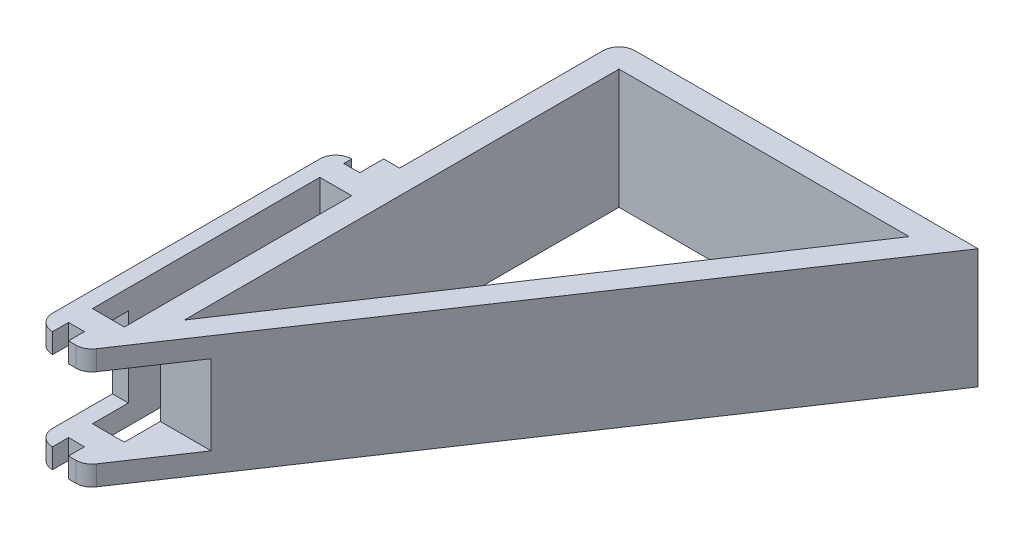
ISO-10303-21;
HEADER;
FILE_DESCRIPTION(('STEP AP214'),'2;1');
FILE_NAME('part.step','',(''),(''),'','','');
FILE_SCHEMA(('AUTOMOTIVE_DESIGN { 1 0 10303 214 1 1 1 1 }'));
ENDSEC;
DATA;
#1=APPLICATION_CONTEXT('core data for automotive mechanical design processes');
#2=APPLICATION_PROTOCOL_DEFINITION('international standard','automotive_design',2000,#1);
#3=PRODUCT_CONTEXT('',#1,'mechanical');
#4=PRODUCT('Part','Part','',(#3));
#5=PRODUCT_RELATED_PRODUCT_CATEGORY('part','',(#4));
#6=PRODUCT_DEFINITION_FORMATION('','',#4);
#7=PRODUCT_DEFINITION_CONTEXT('part definition',#1,'design');
#8=PRODUCT_DEFINITION('design','',#6,#7);
#9=PRODUCT_DEFINITION_SHAPE('','',#8);
#10=(LENGTH_UNIT() NAMED_UNIT(*) SI_UNIT(.MILLI.,.METRE.));
#11=(NAMED_UNIT(*) PLANE_ANGLE_UNIT() SI_UNIT($,.RADIAN.));
#12=(NAMED_UNIT(*) SI_UNIT($,.STERADIAN.) SOLID_ANGLE_UNIT());
#13=UNCERTAINTY_MEASURE_WITH_UNIT(LENGTH_MEASURE(1.E-05),#10,'distance_accuracy_value','');
#14=(GEOMETRIC_REPRESENTATION_CONTEXT(3) GLOBAL_UNCERTAINTY_ASSIGNED_CONTEXT((#13)) GLOBAL_UNIT_ASSIGNED_CONTEXT((#10,
#11,#12)) REPRESENTATION_CONTEXT('',''));
#15=CARTESIAN_POINT('',(0.,0.,0.));
#16=DIRECTION('',(0.,0.,1.));
#17=DIRECTION('',(1.,0.,0.));
#18=AXIS2_PLACEMENT_3D('',#15,#16,#17);
#19=CARTESIAN_POINT('',(0.,15.,-2.));
#20=DIRECTION('',(0.,-1.,0.));
#21=DIRECTION('',(0.,0.,-1.));
#22=AXIS2_PLACEMENT_3D('',#19,#20,#21);
#23=CYLINDRICAL_SURFACE('',#22,2.);
#24=DIRECTION('',(0.,-1.,0.));
#25=VECTOR('',#24,1.);
#26=CARTESIAN_POINT('',(0.,15.,0.));
#27=LINE('',#26,#25);
#28=CARTESIAN_POINT('',(0.,2.5,0.));
#29=VERTEX_POINT('',#28);
#30=CARTESIAN_POINT('',(0.,0.,0.));
#31=VERTEX_POINT('',#30);
#32=EDGE_CURVE('E468',#29,#31,#27,.T.);
#33=ORIENTED_EDGE('',*,*,#32,.F.);
#34=CARTESIAN_POINT('',(0.,2.5,-2.));
#35=DIRECTION('',(0.,1.,0.));
#36=DIRECTION('',(0.,0.,1.));
#37=AXIS2_PLACEMENT_3D('',#34,#35,#36);
#38=CIRCLE('',#37,2.);
#39=CARTESIAN_POINT('',(-2.,2.5,-2.));
#40=VERTEX_POINT('',#39);
#41=EDGE_CURVE('E42',#40,#29,#38,.T.);
#42=ORIENTED_EDGE('',*,*,#41,.F.);
#43=DIRECTION('',(0.,-1.,0.));
#44=VECTOR('',#43,1.);
#45=CARTESIAN_POINT('',(-2.,15.,-2.));
#46=LINE('',#45,#44);
#47=CARTESIAN_POINT('',(-2.,0.,-2.));
#48=VERTEX_POINT('',#47);
#49=EDGE_CURVE('E534',#48,#40,#46,.F.);
#50=ORIENTED_EDGE('',*,*,#49,.F.);
#51=CARTESIAN_POINT('',(0.,0.,-2.));
#52=DIRECTION('',(0.,1.,0.));
#53=DIRECTION('',(0.,0.,1.));
#54=AXIS2_PLACEMENT_3D('',#51,#52,#53);
#55=CIRCLE('',#54,2.);
#56=EDGE_CURVE('E11',#31,#48,#55,.F.);
#57=ORIENTED_EDGE('',*,*,#56,.F.);
#58=EDGE_LOOP('',(#33,#42,#50,#57));
#59=FACE_BOUND('',#58,.T.);
#60=ADVANCED_FACE('F35',(#59),#23,.T.);
#61=CARTESIAN_POINT('',(0.,15.,-2.));
#62=DIRECTION('',(0.,-1.,0.));
#63=DIRECTION('',(0.,0.,-1.));
#64=AXIS2_PLACEMENT_3D('',#61,#62,#63);
#65=CYLINDRICAL_SURFACE('',#64,2.);
#66=CARTESIAN_POINT('',(0.,15.,0.));
#67=VERTEX_POINT('',#66);
#68=CARTESIAN_POINT('',(0.,12.5,0.));
#69=VERTEX_POINT('',#68);
#70=EDGE_CURVE('E469',#67,#69,#27,.T.);
#71=ORIENTED_EDGE('',*,*,#70,.F.);
#72=CARTESIAN_POINT('',(0.,15.,-2.));
#73=DIRECTION('',(0.,1.,0.));
#74=DIRECTION('',(0.,0.,1.));
#75=AXIS2_PLACEMENT_3D('',#72,#73,#74);
#76=CIRCLE('',#75,2.);
#77=CARTESIAN_POINT('',(-2.,15.,-2.));
#78=VERTEX_POINT('',#77);
#79=EDGE_CURVE('E532',#78,#67,#76,.T.);
#80=ORIENTED_EDGE('',*,*,#79,.F.);
#81=DIRECTION('',(0.,-1.,0.));
#82=VECTOR('',#81,1.);
#83=CARTESIAN_POINT('',(-2.,15.,-2.));
#84=LINE('',#83,#82);
#85=CARTESIAN_POINT('',(-2.,12.5,-2.));
#86=VERTEX_POINT('',#85);
#87=EDGE_CURVE('E529',#86,#78,#84,.F.);
#88=ORIENTED_EDGE('',*,*,#87,.F.);
#89=CARTESIAN_POINT('',(0.,12.5,-2.));
#90=DIRECTION('',(0.,-1.,0.));
#91=DIRECTION('',(0.,0.,-1.));
#92=AXIS2_PLACEMENT_3D('',#89,#90,#91);
#93=CIRCLE('',#92,2.);
#94=EDGE_CURVE('E526',#69,#86,#93,.T.);
#95=ORIENTED_EDGE('',*,*,#94,.F.);
#96=EDGE_LOOP('',(#71,#80,#88,#95));
#97=FACE_BOUND('',#96,.T.);
#98=ADVANCED_FACE('F614',(#97),#65,.T.);
#99=CARTESIAN_POINT('',(2.9340491016142,15.,-2.));
#100=DIRECTION('',(0.,-1.,0.));
#101=DIRECTION('',(0.,0.,-1.));
#102=AXIS2_PLACEMENT_3D('',#99,#100,#101);
#103=CYLINDRICAL_SURFACE('',#102,2.);
#104=DIRECTION('',(0.,-1.,0.));
#105=VECTOR('',#104,1.);
#106=CARTESIAN_POINT('',(4.59432751470199,15.,-0.884887633000739));
#107=LINE('',#106,#105);
#108=CARTESIAN_POINT('',(4.59432751470199,15.,-0.88488763300074));
#109=VERTEX_POINT('',#108);
#110=CARTESIAN_POINT('',(4.59432751470199,12.5,-0.884887633000739));
#111=VERTEX_POINT('',#110);
#112=EDGE_CURVE('E517',#109,#111,#107,.T.);
#113=ORIENTED_EDGE('',*,*,#112,.F.);
#114=CARTESIAN_POINT('',(2.9340491016142,15.,-2.));
#115=DIRECTION('',(0.,1.,0.));
#116=DIRECTION('',(0.,0.,1.));
#117=AXIS2_PLACEMENT_3D('',#114,#115,#116);
#118=CIRCLE('',#117,2.);
#119=CARTESIAN_POINT('',(2.9340491016142,15.,0.));
#120=VERTEX_POINT('',#119);
#121=EDGE_CURVE('E522',#120,#109,#118,.T.);
#122=ORIENTED_EDGE('',*,*,#121,.F.);
#123=DIRECTION('',(0.,-1.,0.));
#124=VECTOR('',#123,1.);
#125=CARTESIAN_POINT('',(2.9340491016142,15.,0.));
#126=LINE('',#125,#124);
#127=CARTESIAN_POINT('',(2.9340491016142,12.5,0.));
#128=VERTEX_POINT('',#127);
#129=EDGE_CURVE('E519',#128,#120,#126,.F.);
#130=ORIENTED_EDGE('',*,*,#129,.F.);
#131=CARTESIAN_POINT('',(2.9340491016142,12.5,-2.));
#132=DIRECTION('',(0.,-1.,0.));
#133=DIRECTION('',(0.,0.,-1.));
#134=AXIS2_PLACEMENT_3D('',#131,#132,#133);
#135=CIRCLE('',#134,2.);
#136=EDGE_CURVE('E524',#111,#128,#135,.T.);
#137=ORIENTED_EDGE('',*,*,#136,.F.);
#138=EDGE_LOOP('',(#113,#122,#130,#137));
#139=FACE_BOUND('',#138,.T.);
#140=ADVANCED_FACE('F618',(#139),#103,.T.);
#141=CARTESIAN_POINT('',(2.9340491016142,15.,-2.));
#142=DIRECTION('',(0.,-1.,0.));
#143=DIRECTION('',(0.,0.,-1.));
#144=AXIS2_PLACEMENT_3D('',#141,#142,#143);
#145=CYLINDRICAL_SURFACE('',#144,2.);
#146=DIRECTION('',(0.,-1.,0.));
#147=VECTOR('',#146,1.);
#148=CARTESIAN_POINT('',(4.59432751470199,15.,-0.884887633000739));
#149=LINE('',#148,#147);
#150=CARTESIAN_POINT('',(4.59432751470199,2.5,-0.884887633000739));
#151=VERTEX_POINT('',#150);
#152=CARTESIAN_POINT('',(4.59432751470199,0.,-0.88488763300074));
#153=VERTEX_POINT('',#152);
#154=EDGE_CURVE('E509',#151,#153,#149,.T.);
#155=ORIENTED_EDGE('',*,*,#154,.F.);
#156=CARTESIAN_POINT('',(2.9340491016142,2.5,-2.));
#157=DIRECTION('',(0.,1.,0.));
#158=DIRECTION('',(0.,0.,1.));
#159=AXIS2_PLACEMENT_3D('',#156,#157,#158);
#160=CIRCLE('',#159,2.);
#161=CARTESIAN_POINT('',(2.9340491016142,2.5,0.));
#162=VERTEX_POINT('',#161);
#163=EDGE_CURVE('E273',#162,#151,#160,.T.);
#164=ORIENTED_EDGE('',*,*,#163,.F.);
#165=DIRECTION('',(0.,-1.,0.));
#166=VECTOR('',#165,1.);
#167=CARTESIAN_POINT('',(2.9340491016142,15.,0.));
#168=LINE('',#167,#166);
#169=CARTESIAN_POINT('',(2.9340491016142,0.,0.));
#170=VERTEX_POINT('',#169);
#171=EDGE_CURVE('E511',#170,#162,#168,.F.);
#172=ORIENTED_EDGE('',*,*,#171,.F.);
#173=CARTESIAN_POINT('',(2.9340491016142,0.,-2.));
#174=DIRECTION('',(0.,1.,0.));
#175=DIRECTION('',(0.,0.,1.));
#176=AXIS2_PLACEMENT_3D('',#173,#174,#175);
#177=CIRCLE('',#176,2.);
#178=EDGE_CURVE('E515',#153,#170,#177,.F.);
#179=ORIENTED_EDGE('',*,*,#178,.F.);
#180=EDGE_LOOP('',(#155,#164,#172,#179));
#181=FACE_BOUND('',#180,.T.);
#182=ADVANCED_FACE('F591',(#181),#145,.T.);
#183=CARTESIAN_POINT('',(6.,15.,-65.));
#184=DIRECTION('',(0.,-1.,0.));
#185=DIRECTION('',(0.,0.,-1.));
#186=AXIS2_PLACEMENT_3D('',#183,#184,#185);
#187=CYLINDRICAL_SURFACE('',#186,2.);
#188=DIRECTION('',(0.,-1.,0.));
#189=VECTOR('',#188,1.);
#190=CARTESIAN_POINT('',(4.,15.,-65.));
#191=LINE('',#190,#189);
#192=CARTESIAN_POINT('',(4.,15.,-65.));
#193=VERTEX_POINT('',#192);
#194=CARTESIAN_POINT('',(4.,0.,-65.));
#195=VERTEX_POINT('',#194);
#196=EDGE_CURVE('E499',#193,#195,#191,.T.);
#197=ORIENTED_EDGE('',*,*,#196,.F.);
#198=CARTESIAN_POINT('',(6.,15.,-65.));
#199=DIRECTION('',(0.,1.,0.));
#200=DIRECTION('',(0.,0.,1.));
#201=AXIS2_PLACEMENT_3D('',#198,#199,#200);
#202=CIRCLE('',#201,2.);
#203=CARTESIAN_POINT('',(6.,15.,-67.));
#204=VERTEX_POINT('',#203);
#205=EDGE_CURVE('E505',#204,#193,#202,.T.);
#206=ORIENTED_EDGE('',*,*,#205,.F.);
#207=DIRECTION('',(0.,-1.,0.));
#208=VECTOR('',#207,1.);
#209=CARTESIAN_POINT('',(6.,15.,-67.));
#210=LINE('',#209,#208);
#211=CARTESIAN_POINT('',(6.,0.,-67.));
#212=VERTEX_POINT('',#211);
#213=EDGE_CURVE('E502',#212,#204,#210,.F.);
#214=ORIENTED_EDGE('',*,*,#213,.F.);
#215=CARTESIAN_POINT('',(6.,0.,-65.));
#216=DIRECTION('',(0.,1.,0.));
#217=DIRECTION('',(0.,0.,1.));
#218=AXIS2_PLACEMENT_3D('',#215,#216,#217);
#219=CIRCLE('',#218,2.);
#220=EDGE_CURVE('E507',#195,#212,#219,.F.);
#221=ORIENTED_EDGE('',*,*,#220,.F.);
#222=EDGE_LOOP('',(#197,#206,#214,#221));
#223=FACE_BOUND('',#222,.T.);
#224=ADVANCED_FACE('F582',(#223),#187,.T.);
#225=CARTESIAN_POINT('',(0.,15.,-35.5));
#226=DIRECTION('',(0.,-1.,0.));
#227=DIRECTION('',(0.,0.,-1.));
#228=AXIS2_PLACEMENT_3D('',#225,#226,#227);
#229=CYLINDRICAL_SURFACE('',#228,2.);
#230=DIRECTION('',(0.,-1.,0.));
#231=VECTOR('',#230,1.);
#232=CARTESIAN_POINT('',(-2.,15.,-35.5));
#233=LINE('',#232,#231);
#234=CARTESIAN_POINT('',(-2.,15.,-35.5));
#235=VERTEX_POINT('',#234);
#236=CARTESIAN_POINT('',(-2.,0.,-35.5));
#237=VERTEX_POINT('',#236);
#238=EDGE_CURVE('E492',#235,#237,#233,.T.);
#239=ORIENTED_EDGE('',*,*,#238,.F.);
#240=CARTESIAN_POINT('',(0.,15.,-35.5));
#241=DIRECTION('',(0.,1.,0.));
#242=DIRECTION('',(0.,0.,1.));
#243=AXIS2_PLACEMENT_3D('',#240,#241,#242);
#244=CIRCLE('',#243,2.);
#245=CARTESIAN_POINT('',(0.,15.,-37.5));
#246=VERTEX_POINT('',#245);
#247=EDGE_CURVE('E495',#246,#235,#244,.T.);
#248=ORIENTED_EDGE('',*,*,#247,.F.);
#249=DIRECTION('',(0.,-1.,0.));
#250=VECTOR('',#249,1.);
#251=CARTESIAN_POINT('',(0.,15.,-37.5));
#252=LINE('',#251,#250);
#253=CARTESIAN_POINT('',(0.,0.,-37.5));
#254=VERTEX_POINT('',#253);
#255=EDGE_CURVE('E472',#246,#254,#252,.T.);
#256=ORIENTED_EDGE('',*,*,#255,.T.);
#257=CARTESIAN_POINT('',(0.,0.,-35.5));
#258=DIRECTION('',(0.,1.,0.));
#259=DIRECTION('',(0.,0.,1.));
#260=AXIS2_PLACEMENT_3D('',#257,#258,#259);
#261=CIRCLE('',#260,2.);
#262=EDGE_CURVE('E497',#237,#254,#261,.F.);
#263=ORIENTED_EDGE('',*,*,#262,.F.);
#264=EDGE_LOOP('',(#239,#248,#256,#263));
#265=FACE_BOUND('',#264,.T.);
#266=ADVANCED_FACE('F555',(#265),#229,.T.);
#267=CARTESIAN_POINT('',(0.,15.,0.));
#268=DIRECTION('',(0.,0.,-1.));
#269=DIRECTION('',(-1.,0.,0.));
#270=AXIS2_PLACEMENT_3D('',#267,#268,#269);
#271=PLANE('',#270);
#272=DIRECTION('',(1.,0.,0.));
#273=VECTOR('',#272,1.);
#274=CARTESIAN_POINT('',(0.,0.,0.));
#275=LINE('',#274,#273);
#276=CARTESIAN_POINT('',(2.,0.,0.));
#277=VERTEX_POINT('',#276);
#278=EDGE_CURVE('E409',#277,#170,#275,.T.);
#279=ORIENTED_EDGE('',*,*,#278,.T.);
#280=ORIENTED_EDGE('',*,*,#171,.T.);
#281=DIRECTION('',(1.,0.,0.));
#282=VECTOR('',#281,1.);
#283=CARTESIAN_POINT('',(-120.159716583667,2.5,0.));
#284=LINE('',#283,#282);
#285=CARTESIAN_POINT('',(2.,2.5,0.));
#286=VERTEX_POINT('',#285);
#287=EDGE_CURVE('E297',#286,#162,#284,.T.);
#288=ORIENTED_EDGE('',*,*,#287,.F.);
#289=DIRECTION('',(0.,-1.,0.));
#290=VECTOR('',#289,1.);
#291=CARTESIAN_POINT('',(2.,15.,0.));
#292=LINE('',#291,#290);
#293=EDGE_CURVE('E456',#286,#277,#292,.T.);
#294=ORIENTED_EDGE('',*,*,#293,.T.);
#295=EDGE_LOOP('',(#279,#280,#288,#294));
#296=FACE_BOUND('',#295,.T.);
#297=ADVANCED_FACE('F593',(#296),#271,.F.);
#298=CARTESIAN_POINT('',(0.,15.,-5.));
#299=DIRECTION('',(0.,0.,-1.));
#300=DIRECTION('',(-1.,0.,0.));
#301=AXIS2_PLACEMENT_3D('',#298,#299,#300);
#302=PLANE('',#301);
#303=DIRECTION('',(0.,-1.,0.));
#304=VECTOR('',#303,1.);
#305=CARTESIAN_POINT('',(4.,15.,-5.));
#306=LINE('',#305,#304);
#307=CARTESIAN_POINT('',(4.,15.,-5.));
#308=VERTEX_POINT('',#307);
#309=CARTESIAN_POINT('',(4.,12.5,-5.));
#310=VERTEX_POINT('',#309);
#311=EDGE_CURVE('E442',#308,#310,#306,.T.);
#312=ORIENTED_EDGE('',*,*,#311,.T.);
#313=DIRECTION('',(-1.,0.,0.));
#314=VECTOR('',#313,1.);
#315=CARTESIAN_POINT('',(0.,12.5,-5.));
#316=LINE('',#315,#314);
#317=CARTESIAN_POINT('',(0.,12.5,-5.));
#318=VERTEX_POINT('',#317);
#319=EDGE_CURVE('E323',#310,#318,#316,.T.);
#320=ORIENTED_EDGE('',*,*,#319,.T.);
#321=DIRECTION('',(0.,-1.,0.));
#322=VECTOR('',#321,1.);
#323=CARTESIAN_POINT('',(0.,15.,-5.));
#324=LINE('',#323,#322);
#325=CARTESIAN_POINT('',(0.,15.,-5.));
#326=VERTEX_POINT('',#325);
#327=EDGE_CURVE('E437',#326,#318,#324,.T.);
#328=ORIENTED_EDGE('',*,*,#327,.F.);
#329=DIRECTION('',(1.,0.,0.));
#330=VECTOR('',#329,1.);
#331=CARTESIAN_POINT('',(0.,15.,-5.));
#332=LINE('',#331,#330);
#333=EDGE_CURVE('E368',#326,#308,#332,.T.);
#334=ORIENTED_EDGE('',*,*,#333,.T.);
#335=EDGE_LOOP('',(#312,#320,#328,#334));
#336=FACE_BOUND('',#335,.T.);
#337=ADVANCED_FACE('F696',(#336),#302,.T.);
#338=CARTESIAN_POINT('',(0.,2.5,-5.));
#339=VERTEX_POINT('',#338);
#340=CARTESIAN_POINT('',(0.,0.,-5.));
#341=VERTEX_POINT('',#340);
#342=EDGE_CURVE('E451',#339,#341,#324,.T.);
#343=ORIENTED_EDGE('',*,*,#342,.F.);
#344=DIRECTION('',(1.,0.,0.));
#345=VECTOR('',#344,1.);
#346=CARTESIAN_POINT('',(0.,2.5,-5.));
#347=LINE('',#346,#345);
#348=CARTESIAN_POINT('',(4.00000000000001,2.5,-5.));
#349=VERTEX_POINT('',#348);
#350=EDGE_CURVE('E311',#339,#349,#347,.T.);
#351=ORIENTED_EDGE('',*,*,#350,.T.);
#352=CARTESIAN_POINT('',(4.,0.,-5.));
#353=VERTEX_POINT('',#352);
#354=EDGE_CURVE('E446',#349,#353,#306,.T.);
#355=ORIENTED_EDGE('',*,*,#354,.T.);
#356=DIRECTION('',(1.,0.,0.));
#357=VECTOR('',#356,1.);
#358=CARTESIAN_POINT('',(0.,0.,-5.));
#359=LINE('',#358,#357);
#360=EDGE_CURVE('E417',#341,#353,#359,.T.);
#361=ORIENTED_EDGE('',*,*,#360,.F.);
#362=EDGE_LOOP('',(#343,#351,#355,#361));
#363=FACE_BOUND('',#362,.T.);
#364=ADVANCED_FACE('F651',(#363),#302,.T.);
#365=CARTESIAN_POINT('',(0.,15.,0.));
#366=DIRECTION('',(1.,0.,0.));
#367=DIRECTION('',(0.,0.,-1.));
#368=AXIS2_PLACEMENT_3D('',#365,#366,#367);
#369=PLANE('',#368);
#370=ORIENTED_EDGE('',*,*,#327,.T.);
#371=DIRECTION('',(0.,0.,-1.));
#372=VECTOR('',#371,1.);
#373=CARTESIAN_POINT('',(0.,12.5,0.));
#374=LINE('',#373,#372);
#375=CARTESIAN_POINT('',(0.,12.5,-9.5));
#376=VERTEX_POINT('',#375);
#377=EDGE_CURVE('E325',#318,#376,#374,.T.);
#378=ORIENTED_EDGE('',*,*,#377,.T.);
#379=DIRECTION('',(0.,-1.,0.));
#380=VECTOR('',#379,1.);
#381=CARTESIAN_POINT('',(0.,15.,-9.5));
#382=LINE('',#381,#380);
#383=CARTESIAN_POINT('',(0.,2.5,-9.5));
#384=VERTEX_POINT('',#383);
#385=EDGE_CURVE('E290',#376,#384,#382,.T.);
#386=ORIENTED_EDGE('',*,*,#385,.T.);
#387=DIRECTION('',(0.,0.,1.));
#388=VECTOR('',#387,1.);
#389=CARTESIAN_POINT('',(0.,2.5,0.));
#390=LINE('',#389,#388);
#391=EDGE_CURVE('E278',#384,#339,#390,.T.);
#392=ORIENTED_EDGE('',*,*,#391,.T.);
#393=ORIENTED_EDGE('',*,*,#342,.T.);
#394=DIRECTION('',(0.,0.,1.));
#395=VECTOR('',#394,1.);
#396=CARTESIAN_POINT('',(0.,0.,0.));
#397=LINE('',#396,#395);
#398=CARTESIAN_POINT('',(0.,0.,-33.5));
#399=VERTEX_POINT('',#398);
#400=EDGE_CURVE('E420',#399,#341,#397,.T.);
#401=ORIENTED_EDGE('',*,*,#400,.F.);
#402=DIRECTION('',(0.,-1.,0.));
#403=VECTOR('',#402,1.);
#404=CARTESIAN_POINT('',(0.,15.,-33.5));
#405=LINE('',#404,#403);
#406=CARTESIAN_POINT('',(0.,15.,-33.5));
#407=VERTEX_POINT('',#406);
#408=EDGE_CURVE('E449',#407,#399,#405,.T.);
#409=ORIENTED_EDGE('',*,*,#408,.F.);
#410=DIRECTION('',(0.,0.,1.));
#411=VECTOR('',#410,1.);
#412=CARTESIAN_POINT('',(0.,15.,0.));
#413=LINE('',#412,#411);
#414=EDGE_CURVE('E371',#407,#326,#413,.T.);
#415=ORIENTED_EDGE('',*,*,#414,.T.);
#416=EDGE_LOOP('',(#370,#378,#386,#392,#393,#401,#409,#415));
#417=FACE_BOUND('',#416,.T.);
#418=ADVANCED_FACE('F645',(#417),#369,.T.);
#419=CARTESIAN_POINT('',(0.,15.,0.));
#420=DIRECTION('',(-1.,0.,0.));
#421=DIRECTION('',(0.,0.,1.));
#422=AXIS2_PLACEMENT_3D('',#419,#420,#421);
#423=PLANE('',#422);
#424=DIRECTION('',(0.,0.,1.));
#425=VECTOR('',#424,1.);
#426=CARTESIAN_POINT('',(0.,12.5,0.));
#427=LINE('',#426,#425);
#428=CARTESIAN_POINT('',(0.,12.5,-2.));
#429=VERTEX_POINT('',#428);
#430=EDGE_CURVE('E334',#429,#69,#427,.T.);
#431=ORIENTED_EDGE('',*,*,#430,.F.);
#432=DIRECTION('',(0.,-1.,0.));
#433=VECTOR('',#432,1.);
#434=CARTESIAN_POINT('',(0.,15.,-2.));
#435=LINE('',#434,#433);
#436=CARTESIAN_POINT('',(0.,15.,-2.));
#437=VERTEX_POINT('',#436);
#438=EDGE_CURVE('E465',#437,#429,#435,.T.);
#439=ORIENTED_EDGE('',*,*,#438,.F.);
#440=DIRECTION('',(0.,0.,-1.));
#441=VECTOR('',#440,1.);
#442=CARTESIAN_POINT('',(0.,15.,0.));
#443=LINE('',#442,#441);
#444=EDGE_CURVE('E354',#67,#437,#443,.T.);
#445=ORIENTED_EDGE('',*,*,#444,.F.);
#446=ORIENTED_EDGE('',*,*,#70,.T.);
#447=EDGE_LOOP('',(#431,#439,#445,#446));
#448=FACE_BOUND('',#447,.T.);
#449=ADVANCED_FACE('F643',(#448),#423,.F.);
#450=DIRECTION('',(0.,0.,-1.));
#451=VECTOR('',#450,1.);
#452=CARTESIAN_POINT('',(0.,2.5,0.));
#453=LINE('',#452,#451);
#454=CARTESIAN_POINT('',(0.,2.5,-2.));
#455=VERTEX_POINT('',#454);
#456=EDGE_CURVE('E291',#29,#455,#453,.T.);
#457=ORIENTED_EDGE('',*,*,#456,.F.);
#458=ORIENTED_EDGE('',*,*,#32,.T.);
#459=DIRECTION('',(0.,0.,-1.));
#460=VECTOR('',#459,1.);
#461=CARTESIAN_POINT('',(0.,0.,0.));
#462=LINE('',#461,#460);
#463=CARTESIAN_POINT('',(0.,0.,-2.));
#464=VERTEX_POINT('',#463);
#465=EDGE_CURVE('E400',#31,#464,#462,.T.);
#466=ORIENTED_EDGE('',*,*,#465,.T.);
#467=EDGE_CURVE('E464',#455,#464,#435,.T.);
#468=ORIENTED_EDGE('',*,*,#467,.F.);
#469=EDGE_LOOP('',(#457,#458,#466,#468));
#470=FACE_BOUND('',#469,.T.);
#471=ADVANCED_FACE('F540',(#470),#423,.F.);
#472=CARTESIAN_POINT('',(0.,15.,-2.));
#473=DIRECTION('',(0.,0.,-1.));
#474=DIRECTION('',(-1.,0.,0.));
#475=AXIS2_PLACEMENT_3D('',#472,#473,#474);
#476=PLANE('',#475);
#477=DIRECTION('',(-1.,0.,0.));
#478=VECTOR('',#477,1.);
#479=CARTESIAN_POINT('',(0.,12.5,-2.));
#480=LINE('',#479,#478);
#481=CARTESIAN_POINT('',(2.,12.5,-2.));
#482=VERTEX_POINT('',#481);
#483=EDGE_CURVE('E331',#482,#429,#480,.T.);
#484=ORIENTED_EDGE('',*,*,#483,.F.);
#485=DIRECTION('',(0.,-1.,0.));
#486=VECTOR('',#485,1.);
#487=CARTESIAN_POINT('',(2.,15.,-2.));
#488=LINE('',#487,#486);
#489=CARTESIAN_POINT('',(2.,15.,-2.));
#490=VERTEX_POINT('',#489);
#491=EDGE_CURVE('E461',#490,#482,#488,.T.);
#492=ORIENTED_EDGE('',*,*,#491,.F.);
#493=DIRECTION('',(1.,0.,0.));
#494=VECTOR('',#493,1.);
#495=CARTESIAN_POINT('',(0.,15.,-2.));
#496=LINE('',#495,#494);
#497=EDGE_CURVE('E356',#437,#490,#496,.T.);
#498=ORIENTED_EDGE('',*,*,#497,.F.);
#499=ORIENTED_EDGE('',*,*,#438,.T.);
#500=EDGE_LOOP('',(#484,#492,#498,#499));
#501=FACE_BOUND('',#500,.T.);
#502=ADVANCED_FACE('F603',(#501),#476,.F.);
#503=DIRECTION('',(1.,0.,0.));
#504=VECTOR('',#503,1.);
#505=CARTESIAN_POINT('',(0.,2.5,-2.));
#506=LINE('',#505,#504);
#507=CARTESIAN_POINT('',(2.,2.5,-2.));
#508=VERTEX_POINT('',#507);
#509=EDGE_CURVE('E317',#455,#508,#506,.T.);
#510=ORIENTED_EDGE('',*,*,#509,.F.);
#511=ORIENTED_EDGE('',*,*,#467,.T.);
#512=DIRECTION('',(1.,0.,0.));
#513=VECTOR('',#512,1.);
#514=CARTESIAN_POINT('',(0.,0.,-2.));
#515=LINE('',#514,#513);
#516=CARTESIAN_POINT('',(2.,0.,-2.));
#517=VERTEX_POINT('',#516);
#518=EDGE_CURVE('E403',#464,#517,#515,.T.);
#519=ORIENTED_EDGE('',*,*,#518,.T.);
#520=EDGE_CURVE('E460',#508,#517,#488,.T.);
#521=ORIENTED_EDGE('',*,*,#520,.F.);
#522=EDGE_LOOP('',(#510,#511,#519,#521));
#523=FACE_BOUND('',#522,.T.);
#524=ADVANCED_FACE('F600',(#523),#476,.F.);
#525=CARTESIAN_POINT('',(2.,15.,0.));
#526=DIRECTION('',(1.,0.,0.));
#527=DIRECTION('',(0.,0.,-1.));
#528=AXIS2_PLACEMENT_3D('',#525,#526,#527);
#529=PLANE('',#528);
#530=DIRECTION('',(0.,0.,-1.));
#531=VECTOR('',#530,1.);
#532=CARTESIAN_POINT('',(2.,12.5,0.));
#533=LINE('',#532,#531);
#534=CARTESIAN_POINT('',(2.,12.5,0.));
#535=VERTEX_POINT('',#534);
#536=EDGE_CURVE('E328',#535,#482,#533,.T.);
#537=ORIENTED_EDGE('',*,*,#536,.F.);
#538=CARTESIAN_POINT('',(2.,15.,0.));
#539=VERTEX_POINT('',#538);
#540=EDGE_CURVE('E457',#539,#535,#292,.T.);
#541=ORIENTED_EDGE('',*,*,#540,.F.);
#542=DIRECTION('',(0.,0.,1.));
#543=VECTOR('',#542,1.);
#544=CARTESIAN_POINT('',(2.,15.,0.));
#545=LINE('',#544,#543);
#546=EDGE_CURVE('E358',#490,#539,#545,.T.);
#547=ORIENTED_EDGE('',*,*,#546,.F.);
#548=ORIENTED_EDGE('',*,*,#491,.T.);
#549=EDGE_LOOP('',(#537,#541,#547,#548));
#550=FACE_BOUND('',#549,.T.);
#551=ADVANCED_FACE('F602',(#550),#529,.F.);
#552=DIRECTION('',(0.,0.,1.));
#553=VECTOR('',#552,1.);
#554=CARTESIAN_POINT('',(2.,2.5,0.));
#555=LINE('',#554,#553);
#556=EDGE_CURVE('E277',#508,#286,#555,.T.);
#557=ORIENTED_EDGE('',*,*,#556,.F.);
#558=ORIENTED_EDGE('',*,*,#520,.T.);
#559=DIRECTION('',(0.,0.,1.));
#560=VECTOR('',#559,1.);
#561=CARTESIAN_POINT('',(2.,0.,0.));
#562=LINE('',#561,#560);
#563=EDGE_CURVE('E406',#517,#277,#562,.T.);
#564=ORIENTED_EDGE('',*,*,#563,.T.);
#565=ORIENTED_EDGE('',*,*,#293,.F.);
#566=EDGE_LOOP('',(#557,#558,#564,#565));
#567=FACE_BOUND('',#566,.T.);
#568=ADVANCED_FACE('F596',(#567),#529,.F.);
#569=CARTESIAN_POINT('',(2.75652440896531,15.,1.8513969910961));
#570=DIRECTION('',(-0.830139206543894,0.,-0.55755618349963));
#571=DIRECTION('',(-0.55755618349963,0.,0.830139206543894));
#572=AXIS2_PLACEMENT_3D('',#569,#570,#571);
#573=PLANE('',#572);
#574=DIRECTION('',(0.55755618349963,0.,-0.830139206543895));
#575=VECTOR('',#574,1.);
#576=CARTESIAN_POINT('',(2.75652440896531,15.,1.8513969910961));
#577=LINE('',#576,#575);
#578=CARTESIAN_POINT('',(49.,15.,-67.));
#579=VERTEX_POINT('',#578);
#580=EDGE_CURVE('E363',#109,#579,#577,.T.);
#581=ORIENTED_EDGE('',*,*,#580,.F.);
#582=ORIENTED_EDGE('',*,*,#112,.T.);
#583=DIRECTION('',(-0.55755618349963,0.,0.830139206543894));
#584=VECTOR('',#583,1.);
#585=CARTESIAN_POINT('',(2.75652440896531,12.5,1.8513969910961));
#586=LINE('',#585,#584);
#587=CARTESIAN_POINT('',(10.3805970149254,12.5,-9.50000000000001));
#588=VERTEX_POINT('',#587);
#589=EDGE_CURVE('E286',#588,#111,#586,.T.);
#590=ORIENTED_EDGE('',*,*,#589,.F.);
#591=DIRECTION('',(0.,1.,0.));
#592=VECTOR('',#591,1.);
#593=CARTESIAN_POINT('',(10.3805970149254,15.,-9.50000000000001));
#594=LINE('',#593,#592);
#595=CARTESIAN_POINT('',(10.3805970149254,2.5,-9.50000000000001));
#596=VERTEX_POINT('',#595);
#597=EDGE_CURVE('E281',#596,#588,#594,.T.);
#598=ORIENTED_EDGE('',*,*,#597,.F.);
#599=DIRECTION('',(0.55755618349963,0.,-0.830139206543894));
#600=VECTOR('',#599,1.);
#601=CARTESIAN_POINT('',(2.7565244089653,2.5,1.8513969910961));
#602=LINE('',#601,#600);
#603=EDGE_CURVE('E265',#151,#596,#602,.T.);
#604=ORIENTED_EDGE('',*,*,#603,.F.);
#605=ORIENTED_EDGE('',*,*,#154,.T.);
#606=DIRECTION('',(0.55755618349963,0.,-0.830139206543895));
#607=VECTOR('',#606,1.);
#608=CARTESIAN_POINT('',(2.75652440896531,0.,1.8513969910961));
#609=LINE('',#608,#607);
#610=CARTESIAN_POINT('',(49.,0.,-67.));
#611=VERTEX_POINT('',#610);
#612=EDGE_CURVE('E412',#153,#611,#609,.T.);
#613=ORIENTED_EDGE('',*,*,#612,.T.);
#614=DIRECTION('',(0.,-1.,0.));
#615=VECTOR('',#614,1.);
#616=CARTESIAN_POINT('',(49.,15.,-67.));
#617=LINE('',#616,#615);
#618=EDGE_CURVE('E385',#579,#611,#617,.T.);
#619=ORIENTED_EDGE('',*,*,#618,.F.);
#620=EDGE_LOOP('',(#581,#582,#590,#598,#604,#605,#613,#619));
#621=FACE_BOUND('',#620,.T.);
#622=ADVANCED_FACE('F283',(#621),#573,.F.);
#623=CARTESIAN_POINT('',(4.00000000000001,15.,0.));
#624=DIRECTION('',(1.,0.,0.));
#625=DIRECTION('',(0.,0.,-1.));
#626=AXIS2_PLACEMENT_3D('',#623,#624,#625);
#627=PLANE('',#626);
#628=DIRECTION('',(0.,0.,-1.));
#629=VECTOR('',#628,1.);
#630=CARTESIAN_POINT('',(4.00000000000001,12.5,0.));
#631=LINE('',#630,#629);
#632=CARTESIAN_POINT('',(4.00000000000001,12.5,-9.5));
#633=VERTEX_POINT('',#632);
#634=EDGE_CURVE('E489',#310,#633,#631,.T.);
#635=ORIENTED_EDGE('',*,*,#634,.F.);
#636=ORIENTED_EDGE('',*,*,#311,.F.);
#637=DIRECTION('',(0.,0.,1.));
#638=VECTOR('',#637,1.);
#639=CARTESIAN_POINT('',(4.00000000000001,15.,0.));
#640=LINE('',#639,#638);
#641=CARTESIAN_POINT('',(4.,15.,-33.5));
#642=VERTEX_POINT('',#641);
#643=EDGE_CURVE('E342',#642,#308,#640,.T.);
#644=ORIENTED_EDGE('',*,*,#643,.F.);
#645=DIRECTION('',(0.,-1.,0.));
#646=VECTOR('',#645,1.);
#647=CARTESIAN_POINT('',(4.,15.,-33.5));
#648=LINE('',#647,#646);
#649=CARTESIAN_POINT('',(4.,0.,-33.5));
#650=VERTEX_POINT('',#649);
#651=EDGE_CURVE('E445',#642,#650,#648,.T.);
#652=ORIENTED_EDGE('',*,*,#651,.T.);
#653=DIRECTION('',(0.,0.,1.));
#654=VECTOR('',#653,1.);
#655=CARTESIAN_POINT('',(4.00000000000001,0.,0.));
#656=LINE('',#655,#654);
#657=EDGE_CURVE('E388',#650,#353,#656,.T.);
#658=ORIENTED_EDGE('',*,*,#657,.T.);
#659=ORIENTED_EDGE('',*,*,#354,.F.);
#660=DIRECTION('',(0.,0.,1.));
#661=VECTOR('',#660,1.);
#662=CARTESIAN_POINT('',(4.00000000000001,2.5,0.));
#663=LINE('',#662,#661);
#664=CARTESIAN_POINT('',(4.00000000000001,2.5,-9.5));
#665=VERTEX_POINT('',#664);
#666=EDGE_CURVE('E441',#665,#349,#663,.T.);
#667=ORIENTED_EDGE('',*,*,#666,.F.);
#668=DIRECTION('',(0.,-1.,0.));
#669=VECTOR('',#668,1.);
#670=CARTESIAN_POINT('',(4.00000000000001,15.,-9.5));
#671=LINE('',#670,#669);
#672=EDGE_CURVE('E295',#633,#665,#671,.T.);
#673=ORIENTED_EDGE('',*,*,#672,.F.);
#674=EDGE_LOOP('',(#635,#636,#644,#652,#658,#659,#667,#673));
#675=FACE_BOUND('',#674,.T.);
#676=ADVANCED_FACE('F700',(#675),#627,.F.);
#677=CARTESIAN_POINT('',(7.00000000000001,15.,0.));
#678=DIRECTION('',(1.,0.,0.));
#679=DIRECTION('',(0.,0.,-1.));
#680=AXIS2_PLACEMENT_3D('',#677,#678,#679);
#681=PLANE('',#680);
#682=DIRECTION('',(0.,0.,1.));
#683=VECTOR('',#682,1.);
#684=CARTESIAN_POINT('',(7.00000000000001,0.,0.));
#685=LINE('',#684,#683);
#686=CARTESIAN_POINT('',(7.,0.,-64.));
#687=VERTEX_POINT('',#686);
#688=CARTESIAN_POINT('',(7.00000000000001,0.,-9.51623848099053));
#689=VERTEX_POINT('',#688);
#690=EDGE_CURVE('E426',#687,#689,#685,.T.);
#691=ORIENTED_EDGE('',*,*,#690,.F.);
#692=DIRECTION('',(0.,-1.,0.));
#693=VECTOR('',#692,1.);
#694=CARTESIAN_POINT('',(7.,15.,-64.));
#695=LINE('',#694,#693);
#696=CARTESIAN_POINT('',(7.,15.,-64.));
#697=VERTEX_POINT('',#696);
#698=EDGE_CURVE('E439',#697,#687,#695,.T.);
#699=ORIENTED_EDGE('',*,*,#698,.F.);
#700=DIRECTION('',(0.,0.,1.));
#701=VECTOR('',#700,1.);
#702=CARTESIAN_POINT('',(7.00000000000001,15.,0.));
#703=LINE('',#702,#701);
#704=CARTESIAN_POINT('',(7.00000000000001,15.,-9.51623848099053));
#705=VERTEX_POINT('',#704);
#706=EDGE_CURVE('E377',#697,#705,#703,.T.);
#707=ORIENTED_EDGE('',*,*,#706,.T.);
#708=DIRECTION('',(0.,-1.,0.));
#709=VECTOR('',#708,1.);
#710=CARTESIAN_POINT('',(7.00000000000001,15.,-9.51623848099053));
#711=LINE('',#710,#709);
#712=EDGE_CURVE('E434',#705,#689,#711,.T.);
#713=ORIENTED_EDGE('',*,*,#712,.T.);
#714=EDGE_LOOP('',(#691,#699,#707,#713));
#715=FACE_BOUND('',#714,.T.);
#716=ADVANCED_FACE('F702',(#715),#681,.T.);
#717=CARTESIAN_POINT('',(0.,15.,-64.));
#718=DIRECTION('',(0.,0.,-1.));
#719=DIRECTION('',(-1.,0.,0.));
#720=AXIS2_PLACEMENT_3D('',#717,#718,#719);
#721=PLANE('',#720);
#722=DIRECTION('',(1.,0.,0.));
#723=VECTOR('',#722,1.);
#724=CARTESIAN_POINT('',(0.,0.,-64.));
#725=LINE('',#724,#723);
#726=CARTESIAN_POINT('',(43.3712229061526,0.,-64.));
#727=VERTEX_POINT('',#726);
#728=EDGE_CURVE('E429',#687,#727,#725,.T.);
#729=ORIENTED_EDGE('',*,*,#728,.T.);
#730=DIRECTION('',(0.,-1.,0.));
#731=VECTOR('',#730,1.);
#732=CARTESIAN_POINT('',(43.3712229061526,15.,-64.));
#733=LINE('',#732,#731);
#734=CARTESIAN_POINT('',(43.3712229061526,15.,-64.));
#735=VERTEX_POINT('',#734);
#736=EDGE_CURVE('E436',#735,#727,#733,.T.);
#737=ORIENTED_EDGE('',*,*,#736,.F.);
#738=DIRECTION('',(1.,0.,0.));
#739=VECTOR('',#738,1.);
#740=CARTESIAN_POINT('',(0.,15.,-64.));
#741=LINE('',#740,#739);
#742=EDGE_CURVE('E380',#697,#735,#741,.T.);
#743=ORIENTED_EDGE('',*,*,#742,.F.);
#744=ORIENTED_EDGE('',*,*,#698,.T.);
#745=EDGE_LOOP('',(#729,#737,#743,#744));
#746=FACE_BOUND('',#745,.T.);
#747=ADVANCED_FACE('F708',(#746),#721,.F.);
#748=CARTESIAN_POINT('',(0.,15.,-33.5));
#749=DIRECTION('',(0.,0.,-1.));
#750=DIRECTION('',(-1.,0.,0.));
#751=AXIS2_PLACEMENT_3D('',#748,#749,#750);
#752=PLANE('',#751);
#753=DIRECTION('',(1.,0.,0.));
#754=VECTOR('',#753,1.);
#755=CARTESIAN_POINT('',(0.,0.,-33.5));
#756=LINE('',#755,#754);
#757=EDGE_CURVE('E423',#399,#650,#756,.T.);
#758=ORIENTED_EDGE('',*,*,#757,.T.);
#759=ORIENTED_EDGE('',*,*,#651,.F.);
#760=DIRECTION('',(1.,0.,0.));
#761=VECTOR('',#760,1.);
#762=CARTESIAN_POINT('',(0.,15.,-33.5));
#763=LINE('',#762,#761);
#764=EDGE_CURVE('E374',#407,#642,#763,.T.);
#765=ORIENTED_EDGE('',*,*,#764,.F.);
#766=ORIENTED_EDGE('',*,*,#408,.T.);
#767=EDGE_LOOP('',(#758,#759,#765,#766));
#768=FACE_BOUND('',#767,.T.);
#769=ADVANCED_FACE('F691',(#768),#752,.F.);
#770=CARTESIAN_POINT('',(4.,15.,-39.5));
#771=VERTEX_POINT('',#770);
#772=EDGE_CURVE('E338',#193,#771,#640,.T.);
#773=ORIENTED_EDGE('',*,*,#772,.F.);
#774=ORIENTED_EDGE('',*,*,#196,.T.);
#775=CARTESIAN_POINT('',(4.,0.,-39.5));
#776=VERTEX_POINT('',#775);
#777=EDGE_CURVE('E337',#195,#776,#656,.T.);
#778=ORIENTED_EDGE('',*,*,#777,.T.);
#779=DIRECTION('',(0.,-1.,0.));
#780=VECTOR('',#779,1.);
#781=CARTESIAN_POINT('',(4.,15.,-39.5));
#782=LINE('',#781,#780);
#783=EDGE_CURVE('E484',#771,#776,#782,.T.);
#784=ORIENTED_EDGE('',*,*,#783,.F.);
#785=EDGE_LOOP('',(#773,#774,#778,#784));
#786=FACE_BOUND('',#785,.T.);
#787=ADVANCED_FACE('F576',(#786),#627,.F.);
#788=CARTESIAN_POINT('',(0.,15.,-39.5));
#789=DIRECTION('',(0.,0.,1.));
#790=DIRECTION('',(1.,0.,0.));
#791=AXIS2_PLACEMENT_3D('',#788,#789,#790);
#792=PLANE('',#791);
#793=DIRECTION('',(-1.,0.,0.));
#794=VECTOR('',#793,1.);
#795=CARTESIAN_POINT('',(0.,0.,-39.5));
#796=LINE('',#795,#794);
#797=CARTESIAN_POINT('',(2.,0.,-39.5));
#798=VERTEX_POINT('',#797);
#799=EDGE_CURVE('E387',#776,#798,#796,.T.);
#800=ORIENTED_EDGE('',*,*,#799,.T.);
#801=DIRECTION('',(0.,-1.,0.));
#802=VECTOR('',#801,1.);
#803=CARTESIAN_POINT('',(2.,15.,-39.5));
#804=LINE('',#803,#802);
#805=CARTESIAN_POINT('',(2.,15.,-39.5));
#806=VERTEX_POINT('',#805);
#807=EDGE_CURVE('E481',#806,#798,#804,.T.);
#808=ORIENTED_EDGE('',*,*,#807,.F.);
#809=DIRECTION('',(-1.,0.,0.));
#810=VECTOR('',#809,1.);
#811=CARTESIAN_POINT('',(0.,15.,-39.5));
#812=LINE('',#811,#810);
#813=EDGE_CURVE('E340',#771,#806,#812,.T.);
#814=ORIENTED_EDGE('',*,*,#813,.F.);
#815=ORIENTED_EDGE('',*,*,#783,.T.);
#816=EDGE_LOOP('',(#800,#808,#814,#815));
#817=FACE_BOUND('',#816,.T.);
#818=ADVANCED_FACE('F572',(#817),#792,.F.);
#819=CARTESIAN_POINT('',(2.00000000000001,15.,0.));
#820=DIRECTION('',(1.,0.,0.));
#821=DIRECTION('',(0.,0.,-1.));
#822=AXIS2_PLACEMENT_3D('',#819,#820,#821);
#823=PLANE('',#822);
#824=DIRECTION('',(0.,0.,1.));
#825=VECTOR('',#824,1.);
#826=CARTESIAN_POINT('',(2.00000000000001,0.,0.));
#827=LINE('',#826,#825);
#828=CARTESIAN_POINT('',(2.,0.,-36.5));
#829=VERTEX_POINT('',#828);
#830=EDGE_CURVE('E390',#798,#829,#827,.T.);
#831=ORIENTED_EDGE('',*,*,#830,.T.);
#832=DIRECTION('',(0.,-1.,0.));
#833=VECTOR('',#832,1.);
#834=CARTESIAN_POINT('',(2.,15.,-36.5));
#835=LINE('',#834,#833);
#836=CARTESIAN_POINT('',(2.,15.,-36.5));
#837=VERTEX_POINT('',#836);
#838=EDGE_CURVE('E478',#837,#829,#835,.T.);
#839=ORIENTED_EDGE('',*,*,#838,.F.);
#840=DIRECTION('',(0.,0.,1.));
#841=VECTOR('',#840,1.);
#842=CARTESIAN_POINT('',(2.00000000000001,15.,0.));
#843=LINE('',#842,#841);
#844=EDGE_CURVE('E344',#806,#837,#843,.T.);
#845=ORIENTED_EDGE('',*,*,#844,.F.);
#846=ORIENTED_EDGE('',*,*,#807,.T.);
#847=EDGE_LOOP('',(#831,#839,#845,#846));
#848=FACE_BOUND('',#847,.T.);
#849=ADVANCED_FACE('F568',(#848),#823,.F.);
#850=CARTESIAN_POINT('',(-1.26634813746307E-13,15.,-36.5));
#851=DIRECTION('',(0.,0.,1.));
#852=DIRECTION('',(1.,0.,0.));
#853=AXIS2_PLACEMENT_3D('',#850,#851,#852);
#854=PLANE('',#853);
#855=DIRECTION('',(-1.,0.,0.));
#856=VECTOR('',#855,1.);
#857=CARTESIAN_POINT('',(-1.26634813746307E-13,0.,-36.5));
#858=LINE('',#857,#856);
#859=CARTESIAN_POINT('',(0.,0.,-36.5));
#860=VERTEX_POINT('',#859);
#861=EDGE_CURVE('E392',#829,#860,#858,.T.);
#862=ORIENTED_EDGE('',*,*,#861,.T.);
#863=DIRECTION('',(0.,-1.,0.));
#864=VECTOR('',#863,1.);
#865=CARTESIAN_POINT('',(0.,15.,-36.5));
#866=LINE('',#865,#864);
#867=CARTESIAN_POINT('',(0.,15.,-36.5));
#868=VERTEX_POINT('',#867);
#869=EDGE_CURVE('E475',#868,#860,#866,.T.);
#870=ORIENTED_EDGE('',*,*,#869,.F.);
#871=DIRECTION('',(-1.,0.,0.));
#872=VECTOR('',#871,1.);
#873=CARTESIAN_POINT('',(-1.26634813746307E-13,15.,-36.5));
#874=LINE('',#873,#872);
#875=EDGE_CURVE('E346',#837,#868,#874,.T.);
#876=ORIENTED_EDGE('',*,*,#875,.F.);
#877=ORIENTED_EDGE('',*,*,#838,.T.);
#878=EDGE_LOOP('',(#862,#870,#876,#877));
#879=FACE_BOUND('',#878,.T.);
#880=ADVANCED_FACE('F563',(#879),#854,.F.);
#881=CARTESIAN_POINT('',(0.,15.,0.));
#882=DIRECTION('',(-1.,0.,0.));
#883=DIRECTION('',(0.,0.,1.));
#884=AXIS2_PLACEMENT_3D('',#881,#882,#883);
#885=PLANE('',#884);
#886=DIRECTION('',(0.,0.,-1.));
#887=VECTOR('',#886,1.);
#888=CARTESIAN_POINT('',(0.,0.,0.));
#889=LINE('',#888,#887);
#890=EDGE_CURVE('E394',#860,#254,#889,.T.);
#891=ORIENTED_EDGE('',*,*,#890,.T.);
#892=ORIENTED_EDGE('',*,*,#255,.F.);
#893=DIRECTION('',(0.,0.,-1.));
#894=VECTOR('',#893,1.);
#895=CARTESIAN_POINT('',(0.,15.,0.));
#896=LINE('',#895,#894);
#897=EDGE_CURVE('E348',#868,#246,#896,.T.);
#898=ORIENTED_EDGE('',*,*,#897,.F.);
#899=ORIENTED_EDGE('',*,*,#869,.T.);
#900=EDGE_LOOP('',(#891,#892,#898,#899));
#901=FACE_BOUND('',#900,.T.);
#902=ADVANCED_FACE('F552',(#901),#885,.F.);
#903=CARTESIAN_POINT('',(-2.,15.,0.));
#904=DIRECTION('',(1.,0.,0.));
#905=DIRECTION('',(0.,0.,-1.));
#906=AXIS2_PLACEMENT_3D('',#903,#904,#905);
#907=PLANE('',#906);
#908=DIRECTION('',(0.,0.,1.));
#909=VECTOR('',#908,1.);
#910=CARTESIAN_POINT('',(-2.,0.,0.));
#911=LINE('',#910,#909);
#912=EDGE_CURVE('E397',#237,#48,#911,.T.);
#913=ORIENTED_EDGE('',*,*,#912,.T.);
#914=ORIENTED_EDGE('',*,*,#49,.T.);
#915=DIRECTION('',(0.,0.,-1.));
#916=VECTOR('',#915,1.);
#917=CARTESIAN_POINT('',(-2.,2.5,0.));
#918=LINE('',#917,#916);
#919=CARTESIAN_POINT('',(-2.,2.5,-9.5));
#920=VERTEX_POINT('',#919);
#921=EDGE_CURVE('E301',#40,#920,#918,.T.);
#922=ORIENTED_EDGE('',*,*,#921,.T.);
#923=DIRECTION('',(0.,1.,0.));
#924=VECTOR('',#923,1.);
#925=CARTESIAN_POINT('',(-2.,2.5,-9.5));
#926=LINE('',#925,#924);
#927=CARTESIAN_POINT('',(-2.,12.5,-9.5));
#928=VERTEX_POINT('',#927);
#929=EDGE_CURVE('E672',#920,#928,#926,.T.);
#930=ORIENTED_EDGE('',*,*,#929,.T.);
#931=DIRECTION('',(0.,0.,1.));
#932=VECTOR('',#931,1.);
#933=CARTESIAN_POINT('',(-2.,12.5,-9.49999999999999));
#934=LINE('',#933,#932);
#935=EDGE_CURVE('E669',#928,#86,#934,.T.);
#936=ORIENTED_EDGE('',*,*,#935,.T.);
#937=ORIENTED_EDGE('',*,*,#87,.T.);
#938=DIRECTION('',(0.,0.,1.));
#939=VECTOR('',#938,1.);
#940=CARTESIAN_POINT('',(-2.,15.,0.));
#941=LINE('',#940,#939);
#942=EDGE_CURVE('E351',#235,#78,#941,.T.);
#943=ORIENTED_EDGE('',*,*,#942,.F.);
#944=ORIENTED_EDGE('',*,*,#238,.T.);
#945=EDGE_LOOP('',(#913,#914,#922,#930,#936,#937,#943,#944));
#946=FACE_BOUND('',#945,.T.);
#947=ADVANCED_FACE('F542',(#946),#907,.F.);
#948=DIRECTION('',(1.,0.,0.));
#949=VECTOR('',#948,1.);
#950=CARTESIAN_POINT('',(-120.159716583667,12.5,0.));
#951=LINE('',#950,#949);
#952=EDGE_CURVE('E308',#535,#128,#951,.T.);
#953=ORIENTED_EDGE('',*,*,#952,.T.);
#954=ORIENTED_EDGE('',*,*,#129,.T.);
#955=DIRECTION('',(1.,0.,0.));
#956=VECTOR('',#955,1.);
#957=CARTESIAN_POINT('',(0.,15.,0.));
#958=LINE('',#957,#956);
#959=EDGE_CURVE('E360',#539,#120,#958,.T.);
#960=ORIENTED_EDGE('',*,*,#959,.F.);
#961=ORIENTED_EDGE('',*,*,#540,.T.);
#962=EDGE_LOOP('',(#953,#954,#960,#961));
#963=FACE_BOUND('',#962,.T.);
#964=ADVANCED_FACE('F642',(#963),#271,.F.);
#965=CARTESIAN_POINT('',(0.,15.,-67.));
#966=DIRECTION('',(0.,0.,1.));
#967=DIRECTION('',(1.,0.,0.));
#968=AXIS2_PLACEMENT_3D('',#965,#966,#967);
#969=PLANE('',#968);
#970=DIRECTION('',(-1.,0.,0.));
#971=VECTOR('',#970,1.);
#972=CARTESIAN_POINT('',(0.,0.,-67.));
#973=LINE('',#972,#971);
#974=EDGE_CURVE('E414',#611,#212,#973,.T.);
#975=ORIENTED_EDGE('',*,*,#974,.T.);
#976=ORIENTED_EDGE('',*,*,#213,.T.);
#977=DIRECTION('',(-1.,0.,0.));
#978=VECTOR('',#977,1.);
#979=CARTESIAN_POINT('',(0.,15.,-67.));
#980=LINE('',#979,#978);
#981=EDGE_CURVE('E365',#579,#204,#980,.T.);
#982=ORIENTED_EDGE('',*,*,#981,.F.);
#983=ORIENTED_EDGE('',*,*,#618,.T.);
#984=EDGE_LOOP('',(#975,#976,#982,#983));
#985=FACE_BOUND('',#984,.T.);
#986=ADVANCED_FACE('F585',(#985),#969,.F.);
#987=CARTESIAN_POINT('',(0.447783319347039,15.,0.298922586612264));
#988=DIRECTION('',(-0.831706912477786,0.,-0.555214923913856));
#989=DIRECTION('',(-0.555214923913856,0.,0.831706912477786));
#990=AXIS2_PLACEMENT_3D('',#987,#988,#989);
#991=PLANE('',#990);
#992=DIRECTION('',(0.555214923913856,0.,-0.831706912477786));
#993=VECTOR('',#992,1.);
#994=CARTESIAN_POINT('',(0.447783319347039,0.,0.298922586612264));
#995=LINE('',#994,#993);
#996=EDGE_CURVE('E341',#689,#727,#995,.T.);
#997=ORIENTED_EDGE('',*,*,#996,.F.);
#998=ORIENTED_EDGE('',*,*,#712,.F.);
#999=DIRECTION('',(0.555214923913856,0.,-0.831706912477786));
#1000=VECTOR('',#999,1.);
#1001=CARTESIAN_POINT('',(0.447783319347039,15.,0.298922586612264));
#1002=LINE('',#1001,#1000);
#1003=EDGE_CURVE('E382',#705,#735,#1002,.T.);
#1004=ORIENTED_EDGE('',*,*,#1003,.T.);
#1005=ORIENTED_EDGE('',*,*,#736,.T.);
#1006=EDGE_LOOP('',(#997,#998,#1004,#1005));
#1007=FACE_BOUND('',#1006,.T.);
#1008=ADVANCED_FACE('F726',(#1007),#991,.T.);
#1009=CARTESIAN_POINT('',(0.,15.,0.));
#1010=DIRECTION('',(0.,1.,0.));
#1011=DIRECTION('',(0.,0.,1.));
#1012=AXIS2_PLACEMENT_3D('',#1009,#1010,#1011);
#1013=PLANE('',#1012);
#1014=ORIENTED_EDGE('',*,*,#942,.T.);
#1015=ORIENTED_EDGE('',*,*,#79,.T.);
#1016=ORIENTED_EDGE('',*,*,#444,.T.);
#1017=ORIENTED_EDGE('',*,*,#497,.T.);
#1018=ORIENTED_EDGE('',*,*,#546,.T.);
#1019=ORIENTED_EDGE('',*,*,#959,.T.);
#1020=ORIENTED_EDGE('',*,*,#121,.T.);
#1021=ORIENTED_EDGE('',*,*,#580,.T.);
#1022=ORIENTED_EDGE('',*,*,#981,.T.);
#1023=ORIENTED_EDGE('',*,*,#205,.T.);
#1024=ORIENTED_EDGE('',*,*,#772,.T.);
#1025=ORIENTED_EDGE('',*,*,#813,.T.);
#1026=ORIENTED_EDGE('',*,*,#844,.T.);
#1027=ORIENTED_EDGE('',*,*,#875,.T.);
#1028=ORIENTED_EDGE('',*,*,#897,.T.);
#1029=ORIENTED_EDGE('',*,*,#247,.T.);
#1030=EDGE_LOOP('',(#1014,#1015,#1016,#1017,#1018,#1019,#1020,#1021,#1022,#1023,#1024,#1025,
#1026,#1027,#1028,#1029));
#1031=FACE_BOUND('',#1030,.T.);
#1032=ORIENTED_EDGE('',*,*,#333,.F.);
#1033=ORIENTED_EDGE('',*,*,#414,.F.);
#1034=ORIENTED_EDGE('',*,*,#764,.T.);
#1035=ORIENTED_EDGE('',*,*,#643,.T.);
#1036=EDGE_LOOP('',(#1032,#1033,#1034,#1035));
#1037=FACE_BOUND('',#1036,.T.);
#1038=ORIENTED_EDGE('',*,*,#706,.F.);
#1039=ORIENTED_EDGE('',*,*,#742,.T.);
#1040=ORIENTED_EDGE('',*,*,#1003,.F.);
#1041=EDGE_LOOP('',(#1038,#1039,#1040));
#1042=FACE_BOUND('',#1041,.T.);
#1043=ADVANCED_FACE('F557',(#1031,#1037,#1042),#1013,.T.);
#1044=CARTESIAN_POINT('',(0.,0.,0.));
#1045=DIRECTION('',(0.,1.,0.));
#1046=DIRECTION('',(0.,0.,1.));
#1047=AXIS2_PLACEMENT_3D('',#1044,#1045,#1046);
#1048=PLANE('',#1047);
#1049=ORIENTED_EDGE('',*,*,#465,.F.);
#1050=ORIENTED_EDGE('',*,*,#56,.T.);
#1051=ORIENTED_EDGE('',*,*,#912,.F.);
#1052=ORIENTED_EDGE('',*,*,#262,.T.);
#1053=ORIENTED_EDGE('',*,*,#890,.F.);
#1054=ORIENTED_EDGE('',*,*,#861,.F.);
#1055=ORIENTED_EDGE('',*,*,#830,.F.);
#1056=ORIENTED_EDGE('',*,*,#799,.F.);
#1057=ORIENTED_EDGE('',*,*,#777,.F.);
#1058=ORIENTED_EDGE('',*,*,#220,.T.);
#1059=ORIENTED_EDGE('',*,*,#974,.F.);
#1060=ORIENTED_EDGE('',*,*,#612,.F.);
#1061=ORIENTED_EDGE('',*,*,#178,.T.);
#1062=ORIENTED_EDGE('',*,*,#278,.F.);
#1063=ORIENTED_EDGE('',*,*,#563,.F.);
#1064=ORIENTED_EDGE('',*,*,#518,.F.);
#1065=EDGE_LOOP('',(#1049,#1050,#1051,#1052,#1053,#1054,#1055,#1056,#1057,#1058,#1059,#1060,
#1061,#1062,#1063,#1064));
#1066=FACE_BOUND('',#1065,.T.);
#1067=ORIENTED_EDGE('',*,*,#360,.T.);
#1068=ORIENTED_EDGE('',*,*,#657,.F.);
#1069=ORIENTED_EDGE('',*,*,#757,.F.);
#1070=ORIENTED_EDGE('',*,*,#400,.T.);
#1071=EDGE_LOOP('',(#1067,#1068,#1069,#1070));
#1072=FACE_BOUND('',#1071,.T.);
#1073=ORIENTED_EDGE('',*,*,#690,.T.);
#1074=ORIENTED_EDGE('',*,*,#996,.T.);
#1075=ORIENTED_EDGE('',*,*,#728,.F.);
#1076=EDGE_LOOP('',(#1073,#1074,#1075));
#1077=FACE_BOUND('',#1076,.T.);
#1078=ADVANCED_FACE('F545',(#1066,#1072,#1077),#1048,.F.);
#1079=CARTESIAN_POINT('',(-120.159716583667,12.5,-9.49999999999999));
#1080=DIRECTION('',(0.,-1.,0.));
#1081=DIRECTION('',(0.,0.,-1.));
#1082=AXIS2_PLACEMENT_3D('',#1079,#1080,#1081);
#1083=PLANE('',#1082);
#1084=ORIENTED_EDGE('',*,*,#430,.T.);
#1085=ORIENTED_EDGE('',*,*,#94,.T.);
#1086=ORIENTED_EDGE('',*,*,#935,.F.);
#1087=DIRECTION('',(1.,0.,0.));
#1088=VECTOR('',#1087,1.);
#1089=CARTESIAN_POINT('',(-120.159716583667,12.5,-9.49999999999999));
#1090=LINE('',#1089,#1088);
#1091=EDGE_CURVE('E305',#928,#376,#1090,.T.);
#1092=ORIENTED_EDGE('',*,*,#1091,.T.);
#1093=ORIENTED_EDGE('',*,*,#377,.F.);
#1094=ORIENTED_EDGE('',*,*,#319,.F.);
#1095=ORIENTED_EDGE('',*,*,#634,.T.);
#1096=EDGE_CURVE('E300',#633,#588,#1090,.T.);
#1097=ORIENTED_EDGE('',*,*,#1096,.T.);
#1098=ORIENTED_EDGE('',*,*,#589,.T.);
#1099=ORIENTED_EDGE('',*,*,#136,.T.);
#1100=ORIENTED_EDGE('',*,*,#952,.F.);
#1101=ORIENTED_EDGE('',*,*,#536,.T.);
#1102=ORIENTED_EDGE('',*,*,#483,.T.);
#1103=EDGE_LOOP('',(#1084,#1085,#1086,#1092,#1093,#1094,#1095,#1097,#1098,#1099,#1100,#1101,#1102));
#1104=FACE_BOUND('',#1103,.T.);
#1105=ADVANCED_FACE('F659',(#1104),#1083,.T.);
#1106=CARTESIAN_POINT('',(-120.159716583667,2.5,-9.49999999999999));
#1107=DIRECTION('',(0.,0.,1.));
#1108=DIRECTION('',(1.,0.,0.));
#1109=AXIS2_PLACEMENT_3D('',#1106,#1107,#1108);
#1110=PLANE('',#1109);
#1111=DIRECTION('',(1.,0.,0.));
#1112=VECTOR('',#1111,1.);
#1113=CARTESIAN_POINT('',(-120.159716583667,2.5,-9.49999999999999));
#1114=LINE('',#1113,#1112);
#1115=EDGE_CURVE('E271',#665,#596,#1114,.T.);
#1116=ORIENTED_EDGE('',*,*,#1115,.T.);
#1117=ORIENTED_EDGE('',*,*,#597,.T.);
#1118=ORIENTED_EDGE('',*,*,#1096,.F.);
#1119=ORIENTED_EDGE('',*,*,#672,.T.);
#1120=EDGE_LOOP('',(#1116,#1117,#1118,#1119));
#1121=FACE_BOUND('',#1120,.T.);
#1122=ADVANCED_FACE('F294',(#1121),#1110,.T.);
#1123=CARTESIAN_POINT('',(-120.159716583667,2.5,0.));
#1124=DIRECTION('',(0.,1.,0.));
#1125=DIRECTION('',(0.,0.,1.));
#1126=AXIS2_PLACEMENT_3D('',#1123,#1124,#1125);
#1127=PLANE('',#1126);
#1128=ORIENTED_EDGE('',*,*,#921,.F.);
#1129=ORIENTED_EDGE('',*,*,#41,.T.);
#1130=ORIENTED_EDGE('',*,*,#456,.T.);
#1131=ORIENTED_EDGE('',*,*,#509,.T.);
#1132=ORIENTED_EDGE('',*,*,#556,.T.);
#1133=ORIENTED_EDGE('',*,*,#287,.T.);
#1134=ORIENTED_EDGE('',*,*,#163,.T.);
#1135=ORIENTED_EDGE('',*,*,#603,.T.);
#1136=ORIENTED_EDGE('',*,*,#1115,.F.);
#1137=ORIENTED_EDGE('',*,*,#666,.T.);
#1138=ORIENTED_EDGE('',*,*,#350,.F.);
#1139=ORIENTED_EDGE('',*,*,#391,.F.);
#1140=EDGE_CURVE('E296',#920,#384,#1114,.T.);
#1141=ORIENTED_EDGE('',*,*,#1140,.F.);
#1142=EDGE_LOOP('',(#1128,#1129,#1130,#1131,#1132,#1133,#1134,#1135,#1136,#1137,#1138,#1139,#1141));
#1143=FACE_BOUND('',#1142,.T.);
#1144=ADVANCED_FACE('F268',(#1143),#1127,.T.);
#1145=ORIENTED_EDGE('',*,*,#385,.F.);
#1146=ORIENTED_EDGE('',*,*,#1091,.F.);
#1147=ORIENTED_EDGE('',*,*,#929,.F.);
#1148=ORIENTED_EDGE('',*,*,#1140,.T.);
#1149=EDGE_LOOP('',(#1145,#1146,#1147,#1148));
#1150=FACE_BOUND('',#1149,.T.);
#1151=ADVANCED_FACE('F677',(#1150),#1110,.T.);
#1152=CLOSED_SHELL('',(#60,#98,#140,#182,#224,#266,#297,#337,#364,#418,#449,#471,#502,#524,#551,
#568,#622,#676,#716,#747,#769,#787,#818,#849,#880,#902,#947,#964,#986,#1008,#1043,#1078,#1105,
#1122,#1144,#1151));
#1153=MANIFOLD_SOLID_BREP('B2',#1152);
#1154=ADVANCED_BREP_SHAPE_REPRESENTATION('',(#18,#1153),#14);
#1155=SHAPE_DEFINITION_REPRESENTATION(#9,#1154);
ENDSEC;
END-ISO-10303-21;
